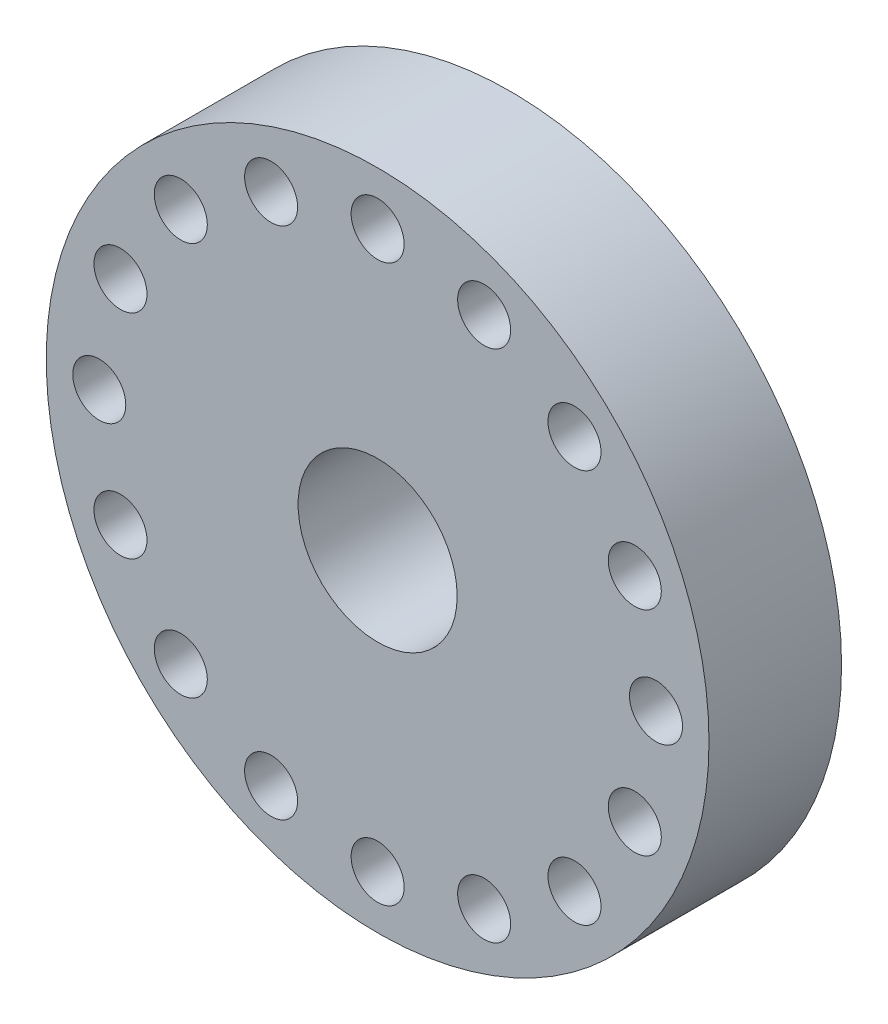
ISO-10303-21;
HEADER;
FILE_DESCRIPTION(('STEP AP214'),'2;1');
FILE_NAME('part.step','',(''),(''),'','','');
FILE_SCHEMA(('AUTOMOTIVE_DESIGN { 1 0 10303 214 1 1 1 1 }'));
ENDSEC;
DATA;
#1=APPLICATION_CONTEXT('core data for automotive mechanical design processes');
#2=APPLICATION_PROTOCOL_DEFINITION('international standard','automotive_design',2000,#1);
#3=PRODUCT_CONTEXT('',#1,'mechanical');
#4=PRODUCT('Part','Part','',(#3));
#5=PRODUCT_RELATED_PRODUCT_CATEGORY('part','',(#4));
#6=PRODUCT_DEFINITION_FORMATION('','',#4);
#7=PRODUCT_DEFINITION_CONTEXT('part definition',#1,'design');
#8=PRODUCT_DEFINITION('design','',#6,#7);
#9=PRODUCT_DEFINITION_SHAPE('','',#8);
#10=(LENGTH_UNIT() NAMED_UNIT(*) SI_UNIT(.MILLI.,.METRE.));
#11=(NAMED_UNIT(*) PLANE_ANGLE_UNIT() SI_UNIT($,.RADIAN.));
#12=(NAMED_UNIT(*) SI_UNIT($,.STERADIAN.) SOLID_ANGLE_UNIT());
#13=UNCERTAINTY_MEASURE_WITH_UNIT(LENGTH_MEASURE(1.E-05),#10,'distance_accuracy_value','');
#14=(GEOMETRIC_REPRESENTATION_CONTEXT(3) GLOBAL_UNCERTAINTY_ASSIGNED_CONTEXT((#13)) GLOBAL_UNIT_ASSIGNED_CONTEXT((#10,
#11,#12)) REPRESENTATION_CONTEXT('',''));
#15=CARTESIAN_POINT('',(0.,0.,0.));
#16=DIRECTION('',(0.,0.,1.));
#17=DIRECTION('',(1.,0.,0.));
#18=AXIS2_PLACEMENT_3D('',#15,#16,#17);
#19=CARTESIAN_POINT('',(0.,0.,20.));
#20=DIRECTION('',(0.,0.,1.));
#21=DIRECTION('',(1.,0.,0.));
#22=AXIS2_PLACEMENT_3D('',#19,#20,#21);
#23=PLANE('',#22);
#24=CARTESIAN_POINT('',(38.802940365474,-16.0727041593338,20.));
#25=DIRECTION('',(0.,0.,1.));
#26=DIRECTION('',(1.,0.,0.));
#27=AXIS2_PLACEMENT_3D('',#24,#25,#26);
#28=CIRCLE('',#27,4.);
#29=CARTESIAN_POINT('',(42.802940365474,-16.0727041593338,20.));
#30=VERTEX_POINT('',#29);
#31=EDGE_CURVE('E136',#30,#30,#28,.T.);
#32=ORIENTED_EDGE('',*,*,#31,.F.);
#33=EDGE_LOOP('',(#32));
#34=FACE_BOUND('',#33,.T.);
#35=CARTESIAN_POINT('',(16.0727041593335,38.8029403654742,20.));
#36=DIRECTION('',(0.,0.,1.));
#37=DIRECTION('',(1.,0.,0.));
#38=AXIS2_PLACEMENT_3D('',#35,#36,#37);
#39=CIRCLE('',#38,4.);
#40=CARTESIAN_POINT('',(20.0727041593335,38.8029403654742,20.));
#41=VERTEX_POINT('',#40);
#42=EDGE_CURVE('E124',#41,#41,#39,.T.);
#43=ORIENTED_EDGE('',*,*,#42,.F.);
#44=EDGE_LOOP('',(#43));
#45=FACE_BOUND('',#44,.T.);
#46=CARTESIAN_POINT('',(-38.802940365474,16.0727041593338,20.));
#47=DIRECTION('',(0.,0.,1.));
#48=DIRECTION('',(1.,0.,0.));
#49=AXIS2_PLACEMENT_3D('',#46,#47,#48);
#50=CIRCLE('',#49,4.);
#51=CARTESIAN_POINT('',(-34.802940365474,16.0727041593338,20.));
#52=VERTEX_POINT('',#51);
#53=EDGE_CURVE('E112',#52,#52,#50,.T.);
#54=ORIENTED_EDGE('',*,*,#53,.F.);
#55=EDGE_LOOP('',(#54));
#56=FACE_BOUND('',#55,.T.);
#57=CARTESIAN_POINT('',(-16.0727041593335,-38.8029403654741,20.));
#58=DIRECTION('',(0.,0.,1.));
#59=DIRECTION('',(1.,0.,0.));
#60=AXIS2_PLACEMENT_3D('',#57,#58,#59);
#61=CIRCLE('',#60,4.);
#62=CARTESIAN_POINT('',(-12.0727041593335,-38.8029403654741,20.));
#63=VERTEX_POINT('',#62);
#64=EDGE_CURVE('E100',#63,#63,#61,.T.);
#65=ORIENTED_EDGE('',*,*,#64,.F.);
#66=EDGE_LOOP('',(#65));
#67=FACE_BOUND('',#66,.T.);
#68=CARTESIAN_POINT('',(0.,-42.,20.));
#69=DIRECTION('',(0.,0.,1.));
#70=DIRECTION('',(1.,0.,0.));
#71=AXIS2_PLACEMENT_3D('',#68,#69,#70);
#72=CIRCLE('',#71,4.);
#73=CARTESIAN_POINT('',(4.,-42.,20.));
#74=VERTEX_POINT('',#73);
#75=EDGE_CURVE('E88',#74,#74,#72,.T.);
#76=ORIENTED_EDGE('',*,*,#75,.F.);
#77=EDGE_LOOP('',(#76));
#78=FACE_BOUND('',#77,.T.);
#79=CARTESIAN_POINT('',(42.,0.,20.));
#80=DIRECTION('',(0.,0.,1.));
#81=DIRECTION('',(1.,0.,0.));
#82=AXIS2_PLACEMENT_3D('',#79,#80,#81);
#83=CIRCLE('',#82,4.);
#84=CARTESIAN_POINT('',(46.,0.,20.));
#85=VERTEX_POINT('',#84);
#86=EDGE_CURVE('E76',#85,#85,#83,.T.);
#87=ORIENTED_EDGE('',*,*,#86,.F.);
#88=EDGE_LOOP('',(#87));
#89=FACE_BOUND('',#88,.T.);
#90=CARTESIAN_POINT('',(0.,42.,20.));
#91=DIRECTION('',(0.,0.,1.));
#92=DIRECTION('',(1.,0.,0.));
#93=AXIS2_PLACEMENT_3D('',#90,#91,#92);
#94=CIRCLE('',#93,4.00000000000001);
#95=CARTESIAN_POINT('',(4.,42.,20.));
#96=VERTEX_POINT('',#95);
#97=EDGE_CURVE('E64',#96,#96,#94,.T.);
#98=ORIENTED_EDGE('',*,*,#97,.F.);
#99=EDGE_LOOP('',(#98));
#100=FACE_BOUND('',#99,.T.);
#101=CARTESIAN_POINT('',(-42.,0.,20.));
#102=DIRECTION('',(0.,0.,1.));
#103=DIRECTION('',(1.,0.,0.));
#104=AXIS2_PLACEMENT_3D('',#101,#102,#103);
#105=CIRCLE('',#104,4.);
#106=CARTESIAN_POINT('',(-38.,0.,20.));
#107=VERTEX_POINT('',#106);
#108=EDGE_CURVE('E52',#107,#107,#105,.T.);
#109=ORIENTED_EDGE('',*,*,#108,.F.);
#110=EDGE_LOOP('',(#109));
#111=FACE_BOUND('',#110,.T.);
#112=CARTESIAN_POINT('',(0.,0.,20.));
#113=DIRECTION('',(0.,0.,1.));
#114=DIRECTION('',(1.,0.,0.));
#115=AXIS2_PLACEMENT_3D('',#112,#113,#114);
#116=CIRCLE('',#115,50.);
#117=CARTESIAN_POINT('',(50.,0.,20.));
#118=VERTEX_POINT('',#117);
#119=EDGE_CURVE('E10',#118,#118,#116,.T.);
#120=ORIENTED_EDGE('',*,*,#119,.T.);
#121=EDGE_LOOP('',(#120));
#122=FACE_BOUND('',#121,.T.);
#123=CARTESIAN_POINT('',(0.,0.,20.));
#124=DIRECTION('',(0.,0.,1.));
#125=DIRECTION('',(1.,0.,0.));
#126=AXIS2_PLACEMENT_3D('',#123,#124,#125);
#127=CIRCLE('',#126,12.);
#128=CARTESIAN_POINT('',(12.,0.,20.));
#129=VERTEX_POINT('',#128);
#130=EDGE_CURVE('E47',#129,#129,#127,.T.);
#131=ORIENTED_EDGE('',*,*,#130,.F.);
#132=EDGE_LOOP('',(#131));
#133=FACE_BOUND('',#132,.T.);
#134=CARTESIAN_POINT('',(-29.6984848098351,29.6984848098349,20.));
#135=DIRECTION('',(0.,0.,1.));
#136=DIRECTION('',(1.,0.,0.));
#137=AXIS2_PLACEMENT_3D('',#134,#135,#136);
#138=CIRCLE('',#137,4.);
#139=CARTESIAN_POINT('',(-25.6984848098351,29.6984848098349,20.));
#140=VERTEX_POINT('',#139);
#141=EDGE_CURVE('E58',#140,#140,#138,.T.);
#142=ORIENTED_EDGE('',*,*,#141,.F.);
#143=EDGE_LOOP('',(#142));
#144=FACE_BOUND('',#143,.T.);
#145=CARTESIAN_POINT('',(29.6984848098348,29.6984848098352,20.));
#146=DIRECTION('',(0.,0.,1.));
#147=DIRECTION('',(1.,0.,0.));
#148=AXIS2_PLACEMENT_3D('',#145,#146,#147);
#149=CIRCLE('',#148,4.);
#150=CARTESIAN_POINT('',(33.6984848098348,29.6984848098352,20.));
#151=VERTEX_POINT('',#150);
#152=EDGE_CURVE('E70',#151,#151,#149,.T.);
#153=ORIENTED_EDGE('',*,*,#152,.F.);
#154=EDGE_LOOP('',(#153));
#155=FACE_BOUND('',#154,.T.);
#156=CARTESIAN_POINT('',(29.6984848098351,-29.6984848098349,20.));
#157=DIRECTION('',(0.,0.,1.));
#158=DIRECTION('',(1.,0.,0.));
#159=AXIS2_PLACEMENT_3D('',#156,#157,#158);
#160=CIRCLE('',#159,4.);
#161=CARTESIAN_POINT('',(33.6984848098351,-29.6984848098349,20.));
#162=VERTEX_POINT('',#161);
#163=EDGE_CURVE('E82',#162,#162,#160,.T.);
#164=ORIENTED_EDGE('',*,*,#163,.F.);
#165=EDGE_LOOP('',(#164));
#166=FACE_BOUND('',#165,.T.);
#167=CARTESIAN_POINT('',(-29.6984848098348,-29.6984848098351,20.));
#168=DIRECTION('',(0.,0.,1.));
#169=DIRECTION('',(1.,0.,0.));
#170=AXIS2_PLACEMENT_3D('',#167,#168,#169);
#171=CIRCLE('',#170,4.);
#172=CARTESIAN_POINT('',(-25.6984848098348,-29.6984848098351,20.));
#173=VERTEX_POINT('',#172);
#174=EDGE_CURVE('E94',#173,#173,#171,.T.);
#175=ORIENTED_EDGE('',*,*,#174,.F.);
#176=EDGE_LOOP('',(#175));
#177=FACE_BOUND('',#176,.T.);
#178=CARTESIAN_POINT('',(-38.8029403654741,-16.0727041593338,20.));
#179=DIRECTION('',(0.,0.,1.));
#180=DIRECTION('',(1.,0.,0.));
#181=AXIS2_PLACEMENT_3D('',#178,#179,#180);
#182=CIRCLE('',#181,4.);
#183=CARTESIAN_POINT('',(-34.802940365474,-16.0727041593338,20.));
#184=VERTEX_POINT('',#183);
#185=EDGE_CURVE('E106',#184,#184,#182,.T.);
#186=ORIENTED_EDGE('',*,*,#185,.F.);
#187=EDGE_LOOP('',(#186));
#188=FACE_BOUND('',#187,.T.);
#189=CARTESIAN_POINT('',(-16.0727041593338,38.802940365474,20.));
#190=DIRECTION('',(0.,0.,1.));
#191=DIRECTION('',(1.,0.,0.));
#192=AXIS2_PLACEMENT_3D('',#189,#190,#191);
#193=CIRCLE('',#192,4.00000000000001);
#194=CARTESIAN_POINT('',(-12.0727041593338,38.802940365474,20.));
#195=VERTEX_POINT('',#194);
#196=EDGE_CURVE('E118',#195,#195,#193,.T.);
#197=ORIENTED_EDGE('',*,*,#196,.F.);
#198=EDGE_LOOP('',(#197));
#199=FACE_BOUND('',#198,.T.);
#200=CARTESIAN_POINT('',(38.802940365474,16.0727041593338,20.));
#201=DIRECTION('',(0.,0.,1.));
#202=DIRECTION('',(1.,0.,0.));
#203=AXIS2_PLACEMENT_3D('',#200,#201,#202);
#204=CIRCLE('',#203,4.);
#205=CARTESIAN_POINT('',(42.802940365474,16.0727041593338,20.));
#206=VERTEX_POINT('',#205);
#207=EDGE_CURVE('E130',#206,#206,#204,.T.);
#208=ORIENTED_EDGE('',*,*,#207,.F.);
#209=EDGE_LOOP('',(#208));
#210=FACE_BOUND('',#209,.T.);
#211=CARTESIAN_POINT('',(16.0727041593338,-38.802940365474,20.));
#212=DIRECTION('',(0.,0.,1.));
#213=DIRECTION('',(1.,0.,0.));
#214=AXIS2_PLACEMENT_3D('',#211,#212,#213);
#215=CIRCLE('',#214,4.00000000000001);
#216=CARTESIAN_POINT('',(20.0727041593338,-38.802940365474,20.));
#217=VERTEX_POINT('',#216);
#218=EDGE_CURVE('E142',#217,#217,#215,.T.);
#219=ORIENTED_EDGE('',*,*,#218,.F.);
#220=EDGE_LOOP('',(#219));
#221=FACE_BOUND('',#220,.T.);
#222=ADVANCED_FACE('F36',(#34,#45,#56,#67,#78,#89,#100,#111,#122,#133,#144,#155,#166,#177,#188,
#199,#210,#221),#23,.T.);
#223=CARTESIAN_POINT('',(0.,0.,0.));
#224=DIRECTION('',(0.,0.,1.));
#225=DIRECTION('',(1.,0.,0.));
#226=AXIS2_PLACEMENT_3D('',#223,#224,#225);
#227=PLANE('',#226);
#228=CARTESIAN_POINT('',(0.,0.,0.));
#229=DIRECTION('',(0.,0.,1.));
#230=DIRECTION('',(1.,0.,0.));
#231=AXIS2_PLACEMENT_3D('',#228,#229,#230);
#232=CIRCLE('',#231,50.);
#233=CARTESIAN_POINT('',(50.,0.,0.));
#234=VERTEX_POINT('',#233);
#235=EDGE_CURVE('E40',#234,#234,#232,.T.);
#236=ORIENTED_EDGE('',*,*,#235,.F.);
#237=EDGE_LOOP('',(#236));
#238=FACE_BOUND('',#237,.T.);
#239=CARTESIAN_POINT('',(0.,0.,0.));
#240=DIRECTION('',(0.,0.,1.));
#241=DIRECTION('',(1.,0.,0.));
#242=AXIS2_PLACEMENT_3D('',#239,#240,#241);
#243=CIRCLE('',#242,12.);
#244=CARTESIAN_POINT('',(12.,0.,0.));
#245=VERTEX_POINT('',#244);
#246=EDGE_CURVE('E49',#245,#245,#243,.T.);
#247=ORIENTED_EDGE('',*,*,#246,.T.);
#248=EDGE_LOOP('',(#247));
#249=FACE_BOUND('',#248,.T.);
#250=CARTESIAN_POINT('',(-42.,0.,0.));
#251=DIRECTION('',(0.,0.,1.));
#252=DIRECTION('',(1.,0.,0.));
#253=AXIS2_PLACEMENT_3D('',#250,#251,#252);
#254=CIRCLE('',#253,4.);
#255=CARTESIAN_POINT('',(-38.,0.,0.));
#256=VERTEX_POINT('',#255);
#257=EDGE_CURVE('E55',#256,#256,#254,.T.);
#258=ORIENTED_EDGE('',*,*,#257,.T.);
#259=EDGE_LOOP('',(#258));
#260=FACE_BOUND('',#259,.T.);
#261=CARTESIAN_POINT('',(-29.6984848098351,29.6984848098349,0.));
#262=DIRECTION('',(0.,0.,1.));
#263=DIRECTION('',(1.,0.,0.));
#264=AXIS2_PLACEMENT_3D('',#261,#262,#263);
#265=CIRCLE('',#264,4.);
#266=CARTESIAN_POINT('',(-25.6984848098351,29.6984848098349,0.));
#267=VERTEX_POINT('',#266);
#268=EDGE_CURVE('E61',#267,#267,#265,.T.);
#269=ORIENTED_EDGE('',*,*,#268,.T.);
#270=EDGE_LOOP('',(#269));
#271=FACE_BOUND('',#270,.T.);
#272=CARTESIAN_POINT('',(0.,42.,0.));
#273=DIRECTION('',(0.,0.,1.));
#274=DIRECTION('',(1.,0.,0.));
#275=AXIS2_PLACEMENT_3D('',#272,#273,#274);
#276=CIRCLE('',#275,4.00000000000001);
#277=CARTESIAN_POINT('',(4.,42.,0.));
#278=VERTEX_POINT('',#277);
#279=EDGE_CURVE('E67',#278,#278,#276,.T.);
#280=ORIENTED_EDGE('',*,*,#279,.T.);
#281=EDGE_LOOP('',(#280));
#282=FACE_BOUND('',#281,.T.);
#283=CARTESIAN_POINT('',(29.6984848098348,29.6984848098352,0.));
#284=DIRECTION('',(0.,0.,1.));
#285=DIRECTION('',(1.,0.,0.));
#286=AXIS2_PLACEMENT_3D('',#283,#284,#285);
#287=CIRCLE('',#286,4.);
#288=CARTESIAN_POINT('',(33.6984848098348,29.6984848098352,0.));
#289=VERTEX_POINT('',#288);
#290=EDGE_CURVE('E73',#289,#289,#287,.T.);
#291=ORIENTED_EDGE('',*,*,#290,.T.);
#292=EDGE_LOOP('',(#291));
#293=FACE_BOUND('',#292,.T.);
#294=CARTESIAN_POINT('',(42.,0.,0.));
#295=DIRECTION('',(0.,0.,1.));
#296=DIRECTION('',(1.,0.,0.));
#297=AXIS2_PLACEMENT_3D('',#294,#295,#296);
#298=CIRCLE('',#297,4.);
#299=CARTESIAN_POINT('',(46.,0.,0.));
#300=VERTEX_POINT('',#299);
#301=EDGE_CURVE('E79',#300,#300,#298,.T.);
#302=ORIENTED_EDGE('',*,*,#301,.T.);
#303=EDGE_LOOP('',(#302));
#304=FACE_BOUND('',#303,.T.);
#305=CARTESIAN_POINT('',(29.6984848098351,-29.6984848098349,0.));
#306=DIRECTION('',(0.,0.,1.));
#307=DIRECTION('',(1.,0.,0.));
#308=AXIS2_PLACEMENT_3D('',#305,#306,#307);
#309=CIRCLE('',#308,4.);
#310=CARTESIAN_POINT('',(33.6984848098351,-29.6984848098349,0.));
#311=VERTEX_POINT('',#310);
#312=EDGE_CURVE('E85',#311,#311,#309,.T.);
#313=ORIENTED_EDGE('',*,*,#312,.T.);
#314=EDGE_LOOP('',(#313));
#315=FACE_BOUND('',#314,.T.);
#316=CARTESIAN_POINT('',(0.,-42.,0.));
#317=DIRECTION('',(0.,0.,1.));
#318=DIRECTION('',(1.,0.,0.));
#319=AXIS2_PLACEMENT_3D('',#316,#317,#318);
#320=CIRCLE('',#319,4.);
#321=CARTESIAN_POINT('',(4.,-42.,0.));
#322=VERTEX_POINT('',#321);
#323=EDGE_CURVE('E91',#322,#322,#320,.T.);
#324=ORIENTED_EDGE('',*,*,#323,.T.);
#325=EDGE_LOOP('',(#324));
#326=FACE_BOUND('',#325,.T.);
#327=CARTESIAN_POINT('',(-29.6984848098348,-29.6984848098351,0.));
#328=DIRECTION('',(0.,0.,1.));
#329=DIRECTION('',(1.,0.,0.));
#330=AXIS2_PLACEMENT_3D('',#327,#328,#329);
#331=CIRCLE('',#330,4.);
#332=CARTESIAN_POINT('',(-25.6984848098348,-29.6984848098351,0.));
#333=VERTEX_POINT('',#332);
#334=EDGE_CURVE('E97',#333,#333,#331,.T.);
#335=ORIENTED_EDGE('',*,*,#334,.T.);
#336=EDGE_LOOP('',(#335));
#337=FACE_BOUND('',#336,.T.);
#338=CARTESIAN_POINT('',(-16.0727041593335,-38.8029403654741,0.));
#339=DIRECTION('',(0.,0.,1.));
#340=DIRECTION('',(1.,0.,0.));
#341=AXIS2_PLACEMENT_3D('',#338,#339,#340);
#342=CIRCLE('',#341,4.);
#343=CARTESIAN_POINT('',(-12.0727041593335,-38.8029403654741,0.));
#344=VERTEX_POINT('',#343);
#345=EDGE_CURVE('E103',#344,#344,#342,.T.);
#346=ORIENTED_EDGE('',*,*,#345,.T.);
#347=EDGE_LOOP('',(#346));
#348=FACE_BOUND('',#347,.T.);
#349=CARTESIAN_POINT('',(-38.8029403654741,-16.0727041593338,0.));
#350=DIRECTION('',(0.,0.,1.));
#351=DIRECTION('',(1.,0.,0.));
#352=AXIS2_PLACEMENT_3D('',#349,#350,#351);
#353=CIRCLE('',#352,4.);
#354=CARTESIAN_POINT('',(-34.802940365474,-16.0727041593338,0.));
#355=VERTEX_POINT('',#354);
#356=EDGE_CURVE('E109',#355,#355,#353,.T.);
#357=ORIENTED_EDGE('',*,*,#356,.T.);
#358=EDGE_LOOP('',(#357));
#359=FACE_BOUND('',#358,.T.);
#360=CARTESIAN_POINT('',(-38.802940365474,16.0727041593338,0.));
#361=DIRECTION('',(0.,0.,1.));
#362=DIRECTION('',(1.,0.,0.));
#363=AXIS2_PLACEMENT_3D('',#360,#361,#362);
#364=CIRCLE('',#363,4.);
#365=CARTESIAN_POINT('',(-34.802940365474,16.0727041593338,0.));
#366=VERTEX_POINT('',#365);
#367=EDGE_CURVE('E115',#366,#366,#364,.T.);
#368=ORIENTED_EDGE('',*,*,#367,.T.);
#369=EDGE_LOOP('',(#368));
#370=FACE_BOUND('',#369,.T.);
#371=CARTESIAN_POINT('',(-16.0727041593338,38.802940365474,0.));
#372=DIRECTION('',(0.,0.,1.));
#373=DIRECTION('',(1.,0.,0.));
#374=AXIS2_PLACEMENT_3D('',#371,#372,#373);
#375=CIRCLE('',#374,4.00000000000001);
#376=CARTESIAN_POINT('',(-12.0727041593338,38.802940365474,0.));
#377=VERTEX_POINT('',#376);
#378=EDGE_CURVE('E121',#377,#377,#375,.T.);
#379=ORIENTED_EDGE('',*,*,#378,.T.);
#380=EDGE_LOOP('',(#379));
#381=FACE_BOUND('',#380,.T.);
#382=CARTESIAN_POINT('',(16.0727041593335,38.8029403654742,0.));
#383=DIRECTION('',(0.,0.,1.));
#384=DIRECTION('',(1.,0.,0.));
#385=AXIS2_PLACEMENT_3D('',#382,#383,#384);
#386=CIRCLE('',#385,4.);
#387=CARTESIAN_POINT('',(20.0727041593335,38.8029403654742,0.));
#388=VERTEX_POINT('',#387);
#389=EDGE_CURVE('E127',#388,#388,#386,.T.);
#390=ORIENTED_EDGE('',*,*,#389,.T.);
#391=EDGE_LOOP('',(#390));
#392=FACE_BOUND('',#391,.T.);
#393=CARTESIAN_POINT('',(38.802940365474,16.0727041593338,0.));
#394=DIRECTION('',(0.,0.,1.));
#395=DIRECTION('',(1.,0.,0.));
#396=AXIS2_PLACEMENT_3D('',#393,#394,#395);
#397=CIRCLE('',#396,4.);
#398=CARTESIAN_POINT('',(42.802940365474,16.0727041593338,0.));
#399=VERTEX_POINT('',#398);
#400=EDGE_CURVE('E133',#399,#399,#397,.T.);
#401=ORIENTED_EDGE('',*,*,#400,.T.);
#402=EDGE_LOOP('',(#401));
#403=FACE_BOUND('',#402,.T.);
#404=CARTESIAN_POINT('',(38.802940365474,-16.0727041593338,0.));
#405=DIRECTION('',(0.,0.,1.));
#406=DIRECTION('',(1.,0.,0.));
#407=AXIS2_PLACEMENT_3D('',#404,#405,#406);
#408=CIRCLE('',#407,4.);
#409=CARTESIAN_POINT('',(42.802940365474,-16.0727041593338,0.));
#410=VERTEX_POINT('',#409);
#411=EDGE_CURVE('E139',#410,#410,#408,.T.);
#412=ORIENTED_EDGE('',*,*,#411,.T.);
#413=EDGE_LOOP('',(#412));
#414=FACE_BOUND('',#413,.T.);
#415=CARTESIAN_POINT('',(16.0727041593338,-38.802940365474,0.));
#416=DIRECTION('',(0.,0.,1.));
#417=DIRECTION('',(1.,0.,0.));
#418=AXIS2_PLACEMENT_3D('',#415,#416,#417);
#419=CIRCLE('',#418,4.00000000000001);
#420=CARTESIAN_POINT('',(20.0727041593338,-38.802940365474,0.));
#421=VERTEX_POINT('',#420);
#422=EDGE_CURVE('E145',#421,#421,#419,.T.);
#423=ORIENTED_EDGE('',*,*,#422,.T.);
#424=EDGE_LOOP('',(#423));
#425=FACE_BOUND('',#424,.T.);
#426=ADVANCED_FACE('F155',(#238,#249,#260,#271,#282,#293,#304,#315,#326,#337,#348,#359,#370,
#381,#392,#403,#414,#425),#227,.F.);
#427=CARTESIAN_POINT('',(0.,0.,20.));
#428=DIRECTION('',(0.,0.,-1.));
#429=DIRECTION('',(-1.,0.,0.));
#430=AXIS2_PLACEMENT_3D('',#427,#428,#429);
#431=CYLINDRICAL_SURFACE('',#430,50.);
#432=ORIENTED_EDGE('',*,*,#119,.F.);
#433=EDGE_LOOP('',(#432));
#434=FACE_BOUND('',#433,.T.);
#435=ORIENTED_EDGE('',*,*,#235,.T.);
#436=EDGE_LOOP('',(#435));
#437=FACE_BOUND('',#436,.T.);
#438=ADVANCED_FACE('F38',(#434,#437),#431,.T.);
#439=CARTESIAN_POINT('',(0.,0.,20.));
#440=DIRECTION('',(0.,0.,-1.));
#441=DIRECTION('',(-1.,0.,0.));
#442=AXIS2_PLACEMENT_3D('',#439,#440,#441);
#443=CYLINDRICAL_SURFACE('',#442,12.);
#444=ORIENTED_EDGE('',*,*,#130,.T.);
#445=EDGE_LOOP('',(#444));
#446=FACE_BOUND('',#445,.T.);
#447=ORIENTED_EDGE('',*,*,#246,.F.);
#448=EDGE_LOOP('',(#447));
#449=FACE_BOUND('',#448,.T.);
#450=ADVANCED_FACE('F165',(#446,#449),#443,.F.);
#451=CARTESIAN_POINT('',(-42.,0.,20.));
#452=DIRECTION('',(0.,0.,-1.));
#453=DIRECTION('',(-1.,0.,0.));
#454=AXIS2_PLACEMENT_3D('',#451,#452,#453);
#455=CYLINDRICAL_SURFACE('',#454,4.);
#456=ORIENTED_EDGE('',*,*,#108,.T.);
#457=EDGE_LOOP('',(#456));
#458=FACE_BOUND('',#457,.T.);
#459=ORIENTED_EDGE('',*,*,#257,.F.);
#460=EDGE_LOOP('',(#459));
#461=FACE_BOUND('',#460,.T.);
#462=ADVANCED_FACE('F168',(#458,#461),#455,.F.);
#463=CARTESIAN_POINT('',(-29.6984848098351,29.6984848098349,20.));
#464=DIRECTION('',(0.,0.,-1.));
#465=DIRECTION('',(-1.,0.,0.));
#466=AXIS2_PLACEMENT_3D('',#463,#464,#465);
#467=CYLINDRICAL_SURFACE('',#466,4.);
#468=ORIENTED_EDGE('',*,*,#141,.T.);
#469=EDGE_LOOP('',(#468));
#470=FACE_BOUND('',#469,.T.);
#471=ORIENTED_EDGE('',*,*,#268,.F.);
#472=EDGE_LOOP('',(#471));
#473=FACE_BOUND('',#472,.T.);
#474=ADVANCED_FACE('F172',(#470,#473),#467,.F.);
#475=CARTESIAN_POINT('',(0.,42.,20.));
#476=DIRECTION('',(0.,0.,-1.));
#477=DIRECTION('',(-1.,0.,0.));
#478=AXIS2_PLACEMENT_3D('',#475,#476,#477);
#479=CYLINDRICAL_SURFACE('',#478,4.00000000000001);
#480=ORIENTED_EDGE('',*,*,#97,.T.);
#481=EDGE_LOOP('',(#480));
#482=FACE_BOUND('',#481,.T.);
#483=ORIENTED_EDGE('',*,*,#279,.F.);
#484=EDGE_LOOP('',(#483));
#485=FACE_BOUND('',#484,.T.);
#486=ADVANCED_FACE('F176',(#482,#485),#479,.F.);
#487=CARTESIAN_POINT('',(29.6984848098348,29.6984848098352,20.));
#488=DIRECTION('',(0.,0.,-1.));
#489=DIRECTION('',(-1.,0.,0.));
#490=AXIS2_PLACEMENT_3D('',#487,#488,#489);
#491=CYLINDRICAL_SURFACE('',#490,4.);
#492=ORIENTED_EDGE('',*,*,#152,.T.);
#493=EDGE_LOOP('',(#492));
#494=FACE_BOUND('',#493,.T.);
#495=ORIENTED_EDGE('',*,*,#290,.F.);
#496=EDGE_LOOP('',(#495));
#497=FACE_BOUND('',#496,.T.);
#498=ADVANCED_FACE('F180',(#494,#497),#491,.F.);
#499=CARTESIAN_POINT('',(42.,0.,20.));
#500=DIRECTION('',(0.,0.,-1.));
#501=DIRECTION('',(-1.,0.,0.));
#502=AXIS2_PLACEMENT_3D('',#499,#500,#501);
#503=CYLINDRICAL_SURFACE('',#502,4.);
#504=ORIENTED_EDGE('',*,*,#86,.T.);
#505=EDGE_LOOP('',(#504));
#506=FACE_BOUND('',#505,.T.);
#507=ORIENTED_EDGE('',*,*,#301,.F.);
#508=EDGE_LOOP('',(#507));
#509=FACE_BOUND('',#508,.T.);
#510=ADVANCED_FACE('F184',(#506,#509),#503,.F.);
#511=CARTESIAN_POINT('',(29.6984848098351,-29.6984848098349,20.));
#512=DIRECTION('',(0.,0.,-1.));
#513=DIRECTION('',(-1.,0.,0.));
#514=AXIS2_PLACEMENT_3D('',#511,#512,#513);
#515=CYLINDRICAL_SURFACE('',#514,4.);
#516=ORIENTED_EDGE('',*,*,#163,.T.);
#517=EDGE_LOOP('',(#516));
#518=FACE_BOUND('',#517,.T.);
#519=ORIENTED_EDGE('',*,*,#312,.F.);
#520=EDGE_LOOP('',(#519));
#521=FACE_BOUND('',#520,.T.);
#522=ADVANCED_FACE('F188',(#518,#521),#515,.F.);
#523=CARTESIAN_POINT('',(0.,-42.,20.));
#524=DIRECTION('',(0.,0.,-1.));
#525=DIRECTION('',(-1.,0.,0.));
#526=AXIS2_PLACEMENT_3D('',#523,#524,#525);
#527=CYLINDRICAL_SURFACE('',#526,4.);
#528=ORIENTED_EDGE('',*,*,#75,.T.);
#529=EDGE_LOOP('',(#528));
#530=FACE_BOUND('',#529,.T.);
#531=ORIENTED_EDGE('',*,*,#323,.F.);
#532=EDGE_LOOP('',(#531));
#533=FACE_BOUND('',#532,.T.);
#534=ADVANCED_FACE('F192',(#530,#533),#527,.F.);
#535=CARTESIAN_POINT('',(-29.6984848098348,-29.6984848098351,20.));
#536=DIRECTION('',(0.,0.,-1.));
#537=DIRECTION('',(-1.,0.,0.));
#538=AXIS2_PLACEMENT_3D('',#535,#536,#537);
#539=CYLINDRICAL_SURFACE('',#538,4.);
#540=ORIENTED_EDGE('',*,*,#174,.T.);
#541=EDGE_LOOP('',(#540));
#542=FACE_BOUND('',#541,.T.);
#543=ORIENTED_EDGE('',*,*,#334,.F.);
#544=EDGE_LOOP('',(#543));
#545=FACE_BOUND('',#544,.T.);
#546=ADVANCED_FACE('F196',(#542,#545),#539,.F.);
#547=CARTESIAN_POINT('',(-16.0727041593335,-38.8029403654741,20.));
#548=DIRECTION('',(0.,0.,-1.));
#549=DIRECTION('',(-1.,0.,0.));
#550=AXIS2_PLACEMENT_3D('',#547,#548,#549);
#551=CYLINDRICAL_SURFACE('',#550,4.);
#552=ORIENTED_EDGE('',*,*,#64,.T.);
#553=EDGE_LOOP('',(#552));
#554=FACE_BOUND('',#553,.T.);
#555=ORIENTED_EDGE('',*,*,#345,.F.);
#556=EDGE_LOOP('',(#555));
#557=FACE_BOUND('',#556,.T.);
#558=ADVANCED_FACE('F200',(#554,#557),#551,.F.);
#559=CARTESIAN_POINT('',(-38.8029403654741,-16.0727041593338,20.));
#560=DIRECTION('',(0.,0.,-1.));
#561=DIRECTION('',(-1.,0.,0.));
#562=AXIS2_PLACEMENT_3D('',#559,#560,#561);
#563=CYLINDRICAL_SURFACE('',#562,4.);
#564=ORIENTED_EDGE('',*,*,#185,.T.);
#565=EDGE_LOOP('',(#564));
#566=FACE_BOUND('',#565,.T.);
#567=ORIENTED_EDGE('',*,*,#356,.F.);
#568=EDGE_LOOP('',(#567));
#569=FACE_BOUND('',#568,.T.);
#570=ADVANCED_FACE('F204',(#566,#569),#563,.F.);
#571=CARTESIAN_POINT('',(-38.802940365474,16.0727041593338,20.));
#572=DIRECTION('',(0.,0.,-1.));
#573=DIRECTION('',(-1.,0.,0.));
#574=AXIS2_PLACEMENT_3D('',#571,#572,#573);
#575=CYLINDRICAL_SURFACE('',#574,4.);
#576=ORIENTED_EDGE('',*,*,#53,.T.);
#577=EDGE_LOOP('',(#576));
#578=FACE_BOUND('',#577,.T.);
#579=ORIENTED_EDGE('',*,*,#367,.F.);
#580=EDGE_LOOP('',(#579));
#581=FACE_BOUND('',#580,.T.);
#582=ADVANCED_FACE('F208',(#578,#581),#575,.F.);
#583=CARTESIAN_POINT('',(-16.0727041593338,38.802940365474,20.));
#584=DIRECTION('',(0.,0.,-1.));
#585=DIRECTION('',(-1.,0.,0.));
#586=AXIS2_PLACEMENT_3D('',#583,#584,#585);
#587=CYLINDRICAL_SURFACE('',#586,4.00000000000001);
#588=ORIENTED_EDGE('',*,*,#196,.T.);
#589=EDGE_LOOP('',(#588));
#590=FACE_BOUND('',#589,.T.);
#591=ORIENTED_EDGE('',*,*,#378,.F.);
#592=EDGE_LOOP('',(#591));
#593=FACE_BOUND('',#592,.T.);
#594=ADVANCED_FACE('F212',(#590,#593),#587,.F.);
#595=CARTESIAN_POINT('',(16.0727041593335,38.8029403654742,20.));
#596=DIRECTION('',(0.,0.,-1.));
#597=DIRECTION('',(-1.,0.,0.));
#598=AXIS2_PLACEMENT_3D('',#595,#596,#597);
#599=CYLINDRICAL_SURFACE('',#598,4.);
#600=ORIENTED_EDGE('',*,*,#42,.T.);
#601=EDGE_LOOP('',(#600));
#602=FACE_BOUND('',#601,.T.);
#603=ORIENTED_EDGE('',*,*,#389,.F.);
#604=EDGE_LOOP('',(#603));
#605=FACE_BOUND('',#604,.T.);
#606=ADVANCED_FACE('F216',(#602,#605),#599,.F.);
#607=CARTESIAN_POINT('',(38.802940365474,16.0727041593338,20.));
#608=DIRECTION('',(0.,0.,-1.));
#609=DIRECTION('',(-1.,0.,0.));
#610=AXIS2_PLACEMENT_3D('',#607,#608,#609);
#611=CYLINDRICAL_SURFACE('',#610,4.);
#612=ORIENTED_EDGE('',*,*,#207,.T.);
#613=EDGE_LOOP('',(#612));
#614=FACE_BOUND('',#613,.T.);
#615=ORIENTED_EDGE('',*,*,#400,.F.);
#616=EDGE_LOOP('',(#615));
#617=FACE_BOUND('',#616,.T.);
#618=ADVANCED_FACE('F220',(#614,#617),#611,.F.);
#619=CARTESIAN_POINT('',(38.802940365474,-16.0727041593338,20.));
#620=DIRECTION('',(0.,0.,-1.));
#621=DIRECTION('',(-1.,0.,0.));
#622=AXIS2_PLACEMENT_3D('',#619,#620,#621);
#623=CYLINDRICAL_SURFACE('',#622,4.);
#624=ORIENTED_EDGE('',*,*,#31,.T.);
#625=EDGE_LOOP('',(#624));
#626=FACE_BOUND('',#625,.T.);
#627=ORIENTED_EDGE('',*,*,#411,.F.);
#628=EDGE_LOOP('',(#627));
#629=FACE_BOUND('',#628,.T.);
#630=ADVANCED_FACE('F224',(#626,#629),#623,.F.);
#631=CARTESIAN_POINT('',(16.0727041593338,-38.802940365474,20.));
#632=DIRECTION('',(0.,0.,-1.));
#633=DIRECTION('',(-1.,0.,0.));
#634=AXIS2_PLACEMENT_3D('',#631,#632,#633);
#635=CYLINDRICAL_SURFACE('',#634,4.00000000000001);
#636=ORIENTED_EDGE('',*,*,#218,.T.);
#637=EDGE_LOOP('',(#636));
#638=FACE_BOUND('',#637,.T.);
#639=ORIENTED_EDGE('',*,*,#422,.F.);
#640=EDGE_LOOP('',(#639));
#641=FACE_BOUND('',#640,.T.);
#642=ADVANCED_FACE('F151',(#638,#641),#635,.F.);
#643=CLOSED_SHELL('',(#222,#426,#438,#450,#462,#474,#486,#498,#510,#522,#534,#546,#558,#570,
#582,#594,#606,#618,#630,#642));
#644=MANIFOLD_SOLID_BREP('B2',#643);
#645=ADVANCED_BREP_SHAPE_REPRESENTATION('',(#18,#644),#14);
#646=SHAPE_DEFINITION_REPRESENTATION(#9,#645);
ENDSEC;
END-ISO-10303-21;
